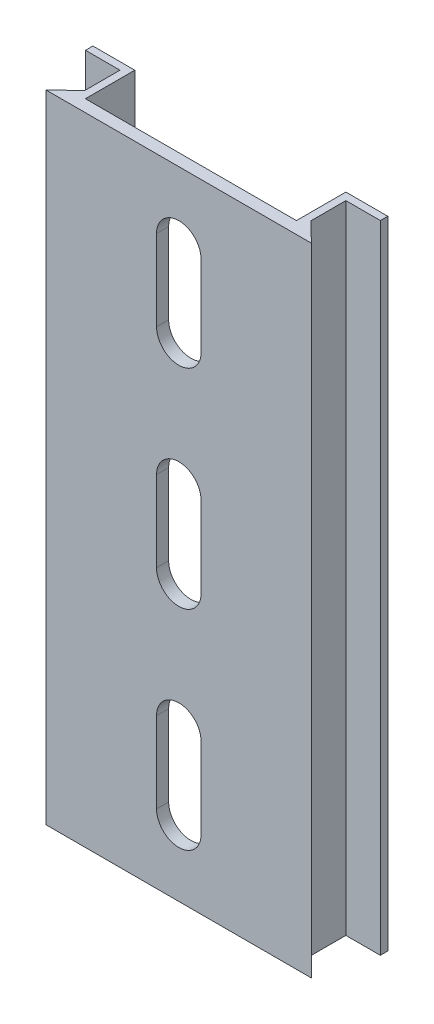
ISO-10303-21;
HEADER;
FILE_DESCRIPTION(('STEP AP214'),'2;1');
FILE_NAME('part.step','',(''),(''),'','','');
FILE_SCHEMA(('AUTOMOTIVE_DESIGN { 1 0 10303 214 1 1 1 1 }'));
ENDSEC;
DATA;
#1=APPLICATION_CONTEXT('core data for automotive mechanical design processes');
#2=APPLICATION_PROTOCOL_DEFINITION('international standard','automotive_design',2000,#1);
#3=PRODUCT_CONTEXT('',#1,'mechanical');
#4=PRODUCT('Part','Part','',(#3));
#5=PRODUCT_RELATED_PRODUCT_CATEGORY('part','',(#4));
#6=PRODUCT_DEFINITION_FORMATION('','',#4);
#7=PRODUCT_DEFINITION_CONTEXT('part definition',#1,'design');
#8=PRODUCT_DEFINITION('design','',#6,#7);
#9=PRODUCT_DEFINITION_SHAPE('','',#8);
#10=(LENGTH_UNIT() NAMED_UNIT(*) SI_UNIT(.MILLI.,.METRE.));
#11=(NAMED_UNIT(*) PLANE_ANGLE_UNIT() SI_UNIT($,.RADIAN.));
#12=(NAMED_UNIT(*) SI_UNIT($,.STERADIAN.) SOLID_ANGLE_UNIT());
#13=UNCERTAINTY_MEASURE_WITH_UNIT(LENGTH_MEASURE(1.E-05),#10,'distance_accuracy_value','');
#14=(GEOMETRIC_REPRESENTATION_CONTEXT(3) GLOBAL_UNCERTAINTY_ASSIGNED_CONTEXT((#13)) GLOBAL_UNIT_ASSIGNED_CONTEXT((#10,
#11,#12)) REPRESENTATION_CONTEXT('',''));
#15=CARTESIAN_POINT('',(0.,0.,0.));
#16=DIRECTION('',(0.,0.,1.));
#17=DIRECTION('',(1.,0.,0.));
#18=AXIS2_PLACEMENT_3D('',#15,#16,#17);
#19=CARTESIAN_POINT('',(0.,38.1,-1.4478));
#20=DIRECTION('',(0.,0.,-1.));
#21=DIRECTION('',(-1.,0.,0.));
#22=AXIS2_PLACEMENT_3D('',#19,#20,#21);
#23=PLANE('',#22);
#24=CARTESIAN_POINT('',(0.,20.167,-1.4478));
#25=DIRECTION('',(0.,0.,-1.));
#26=DIRECTION('',(-1.,0.,0.));
#27=AXIS2_PLACEMENT_3D('',#24,#25,#26);
#28=CIRCLE('',#27,2.667);
#29=CARTESIAN_POINT('',(2.667,20.167,-1.4478));
#30=VERTEX_POINT('',#29);
#31=CARTESIAN_POINT('',(-2.667,20.167,-1.4478));
#32=VERTEX_POINT('',#31);
#33=EDGE_CURVE('E219',#30,#32,#28,.T.);
#34=ORIENTED_EDGE('',*,*,#33,.F.);
#35=DIRECTION('',(0.,-1.,0.));
#36=VECTOR('',#35,1.);
#37=CARTESIAN_POINT('',(2.667,63.1,-1.4478));
#38=LINE('',#37,#36);
#39=CARTESIAN_POINT('',(2.667,29.833,-1.4478));
#40=VERTEX_POINT('',#39);
#41=EDGE_CURVE('E208',#40,#30,#38,.T.);
#42=ORIENTED_EDGE('',*,*,#41,.F.);
#43=CARTESIAN_POINT('',(0.,29.833,-1.4478));
#44=DIRECTION('',(0.,0.,-1.));
#45=DIRECTION('',(-1.,0.,0.));
#46=AXIS2_PLACEMENT_3D('',#43,#44,#45);
#47=CIRCLE('',#46,2.667);
#48=CARTESIAN_POINT('',(-2.667,29.833,-1.4478));
#49=VERTEX_POINT('',#48);
#50=EDGE_CURVE('E49',#49,#40,#47,.T.);
#51=ORIENTED_EDGE('',*,*,#50,.F.);
#52=DIRECTION('',(0.,1.,0.));
#53=VECTOR('',#52,1.);
#54=CARTESIAN_POINT('',(-2.667,63.1,-1.4478));
#55=LINE('',#54,#53);
#56=EDGE_CURVE('E224',#32,#49,#55,.T.);
#57=ORIENTED_EDGE('',*,*,#56,.F.);
#58=EDGE_LOOP('',(#34,#42,#51,#57));
#59=FACE_BOUND('',#58,.T.);
#60=CARTESIAN_POINT('',(0.,-29.833,-1.4478));
#61=DIRECTION('',(0.,0.,-1.));
#62=DIRECTION('',(-1.,0.,0.));
#63=AXIS2_PLACEMENT_3D('',#60,#61,#62);
#64=CIRCLE('',#63,2.667);
#65=CARTESIAN_POINT('',(2.667,-29.833,-1.4478));
#66=VERTEX_POINT('',#65);
#67=CARTESIAN_POINT('',(-2.667,-29.833,-1.4478));
#68=VERTEX_POINT('',#67);
#69=EDGE_CURVE('E257',#66,#68,#64,.T.);
#70=ORIENTED_EDGE('',*,*,#69,.F.);
#71=DIRECTION('',(0.,-1.,0.));
#72=VECTOR('',#71,1.);
#73=CARTESIAN_POINT('',(2.667,13.1,-1.4478));
#74=LINE('',#73,#72);
#75=CARTESIAN_POINT('',(2.667,-20.167,-1.4478));
#76=VERTEX_POINT('',#75);
#77=EDGE_CURVE('E227',#76,#66,#74,.T.);
#78=ORIENTED_EDGE('',*,*,#77,.F.);
#79=CARTESIAN_POINT('',(0.,-20.167,-1.4478));
#80=DIRECTION('',(0.,0.,-1.));
#81=DIRECTION('',(-1.,0.,0.));
#82=AXIS2_PLACEMENT_3D('',#79,#80,#81);
#83=CIRCLE('',#82,2.667);
#84=CARTESIAN_POINT('',(-2.667,-20.167,-1.4478));
#85=VERTEX_POINT('',#84);
#86=EDGE_CURVE('E242',#85,#76,#83,.T.);
#87=ORIENTED_EDGE('',*,*,#86,.F.);
#88=DIRECTION('',(0.,1.,0.));
#89=VECTOR('',#88,1.);
#90=CARTESIAN_POINT('',(-2.667,13.1,-1.4478));
#91=LINE('',#90,#89);
#92=EDGE_CURVE('E249',#68,#85,#91,.T.);
#93=ORIENTED_EDGE('',*,*,#92,.F.);
#94=EDGE_LOOP('',(#70,#78,#87,#93));
#95=FACE_BOUND('',#94,.T.);
#96=CARTESIAN_POINT('',(0.,-4.833,-1.4478));
#97=DIRECTION('',(0.,0.,-1.));
#98=DIRECTION('',(-1.,0.,0.));
#99=AXIS2_PLACEMENT_3D('',#96,#97,#98);
#100=CIRCLE('',#99,2.667);
#101=CARTESIAN_POINT('',(2.667,-4.833,-1.4478));
#102=VERTEX_POINT('',#101);
#103=CARTESIAN_POINT('',(-2.667,-4.833,-1.4478));
#104=VERTEX_POINT('',#103);
#105=EDGE_CURVE('E289',#102,#104,#100,.T.);
#106=ORIENTED_EDGE('',*,*,#105,.F.);
#107=DIRECTION('',(0.,-1.,0.));
#108=VECTOR('',#107,1.);
#109=CARTESIAN_POINT('',(2.667,38.1,-1.4478));
#110=LINE('',#109,#108);
#111=CARTESIAN_POINT('',(2.667,4.833,-1.4478));
#112=VERTEX_POINT('',#111);
#113=EDGE_CURVE('E276',#112,#102,#110,.T.);
#114=ORIENTED_EDGE('',*,*,#113,.F.);
#115=CARTESIAN_POINT('',(0.,4.833,-1.4478));
#116=DIRECTION('',(0.,0.,-1.));
#117=DIRECTION('',(-1.,0.,0.));
#118=AXIS2_PLACEMENT_3D('',#115,#116,#117);
#119=CIRCLE('',#118,2.667);
#120=CARTESIAN_POINT('',(-2.667,4.833,-1.4478));
#121=VERTEX_POINT('',#120);
#122=EDGE_CURVE('E284',#121,#112,#119,.T.);
#123=ORIENTED_EDGE('',*,*,#122,.F.);
#124=DIRECTION('',(0.,1.,0.));
#125=VECTOR('',#124,1.);
#126=CARTESIAN_POINT('',(-2.667,38.1,-1.4478));
#127=LINE('',#126,#125);
#128=EDGE_CURVE('E287',#104,#121,#127,.T.);
#129=ORIENTED_EDGE('',*,*,#128,.F.);
#130=EDGE_LOOP('',(#106,#114,#123,#129));
#131=FACE_BOUND('',#130,.T.);
#132=DIRECTION('',(1.,0.,0.));
#133=VECTOR('',#132,1.);
#134=CARTESIAN_POINT('',(0.,-38.1,-1.4478));
#135=LINE('',#134,#133);
#136=CARTESIAN_POINT('',(-12.6365,-38.1,-1.4478));
#137=VERTEX_POINT('',#136);
#138=CARTESIAN_POINT('',(12.6365,-38.1,-1.4478));
#139=VERTEX_POINT('',#138);
#140=EDGE_CURVE('E291',#137,#139,#135,.T.);
#141=ORIENTED_EDGE('',*,*,#140,.F.);
#142=DIRECTION('',(0.,-1.,0.));
#143=VECTOR('',#142,1.);
#144=CARTESIAN_POINT('',(-12.6365,38.1,-1.4478));
#145=LINE('',#144,#143);
#146=CARTESIAN_POINT('',(-12.6365,38.1,-1.4478));
#147=VERTEX_POINT('',#146);
#148=EDGE_CURVE('E11',#147,#137,#145,.T.);
#149=ORIENTED_EDGE('',*,*,#148,.F.);
#150=DIRECTION('',(1.,0.,0.));
#151=VECTOR('',#150,1.);
#152=CARTESIAN_POINT('',(0.,38.1,-1.4478));
#153=LINE('',#152,#151);
#154=CARTESIAN_POINT('',(12.6365,38.1,-1.4478));
#155=VERTEX_POINT('',#154);
#156=EDGE_CURVE('E292',#147,#155,#153,.T.);
#157=ORIENTED_EDGE('',*,*,#156,.T.);
#158=DIRECTION('',(0.,-1.,0.));
#159=VECTOR('',#158,1.);
#160=CARTESIAN_POINT('',(12.6365,38.1,-1.4478));
#161=LINE('',#160,#159);
#162=EDGE_CURVE('E329',#155,#139,#161,.T.);
#163=ORIENTED_EDGE('',*,*,#162,.T.);
#164=EDGE_LOOP('',(#141,#149,#157,#163));
#165=FACE_BOUND('',#164,.T.);
#166=ADVANCED_FACE('F35',(#59,#95,#131,#165),#23,.T.);
#167=CARTESIAN_POINT('',(-12.6365,38.1,0.));
#168=DIRECTION('',(-1.,0.,0.));
#169=DIRECTION('',(0.,0.,1.));
#170=AXIS2_PLACEMENT_3D('',#167,#168,#169);
#171=PLANE('',#170);
#172=DIRECTION('',(0.,0.,-1.));
#173=VECTOR('',#172,1.);
#174=CARTESIAN_POINT('',(-12.6365,-38.1,0.));
#175=LINE('',#174,#173);
#176=CARTESIAN_POINT('',(-12.6365,-38.1,-7.366));
#177=VERTEX_POINT('',#176);
#178=EDGE_CURVE('E332',#137,#177,#175,.T.);
#179=ORIENTED_EDGE('',*,*,#178,.T.);
#180=DIRECTION('',(0.,-1.,0.));
#181=VECTOR('',#180,1.);
#182=CARTESIAN_POINT('',(-12.6365,38.1,-7.366));
#183=LINE('',#182,#181);
#184=CARTESIAN_POINT('',(-12.6365,38.1,-7.366));
#185=VERTEX_POINT('',#184);
#186=EDGE_CURVE('E42',#185,#177,#183,.T.);
#187=ORIENTED_EDGE('',*,*,#186,.F.);
#188=DIRECTION('',(0.,0.,-1.));
#189=VECTOR('',#188,1.);
#190=CARTESIAN_POINT('',(-12.6365,38.1,0.));
#191=LINE('',#190,#189);
#192=EDGE_CURVE('E295',#147,#185,#191,.T.);
#193=ORIENTED_EDGE('',*,*,#192,.F.);
#194=ORIENTED_EDGE('',*,*,#148,.T.);
#195=EDGE_LOOP('',(#179,#187,#193,#194));
#196=FACE_BOUND('',#195,.T.);
#197=ADVANCED_FACE('F421',(#196),#171,.F.);
#198=CARTESIAN_POINT('',(0.,38.1,-7.366));
#199=DIRECTION('',(0.,0.,1.));
#200=DIRECTION('',(1.,0.,0.));
#201=AXIS2_PLACEMENT_3D('',#198,#199,#200);
#202=PLANE('',#201);
#203=DIRECTION('',(-1.,0.,0.));
#204=VECTOR('',#203,1.);
#205=CARTESIAN_POINT('',(0.,-38.1,-7.366));
#206=LINE('',#205,#204);
#207=CARTESIAN_POINT('',(-17.653,-38.1,-7.366));
#208=VERTEX_POINT('',#207);
#209=EDGE_CURVE('E334',#177,#208,#206,.T.);
#210=ORIENTED_EDGE('',*,*,#209,.T.);
#211=DIRECTION('',(0.,-1.,0.));
#212=VECTOR('',#211,1.);
#213=CARTESIAN_POINT('',(-17.653,38.1,-7.366));
#214=LINE('',#213,#212);
#215=CARTESIAN_POINT('',(-17.653,38.1,-7.366));
#216=VERTEX_POINT('',#215);
#217=EDGE_CURVE('E389',#216,#208,#214,.T.);
#218=ORIENTED_EDGE('',*,*,#217,.F.);
#219=DIRECTION('',(-1.,0.,0.));
#220=VECTOR('',#219,1.);
#221=CARTESIAN_POINT('',(0.,38.1,-7.366));
#222=LINE('',#221,#220);
#223=EDGE_CURVE('E298',#185,#216,#222,.T.);
#224=ORIENTED_EDGE('',*,*,#223,.F.);
#225=ORIENTED_EDGE('',*,*,#186,.T.);
#226=EDGE_LOOP('',(#210,#218,#224,#225));
#227=FACE_BOUND('',#226,.T.);
#228=ADVANCED_FACE('F396',(#227),#202,.F.);
#229=CARTESIAN_POINT('',(-17.653,38.1,0.));
#230=DIRECTION('',(1.,0.,0.));
#231=DIRECTION('',(0.,0.,-1.));
#232=AXIS2_PLACEMENT_3D('',#229,#230,#231);
#233=PLANE('',#232);
#234=DIRECTION('',(0.,0.,1.));
#235=VECTOR('',#234,1.);
#236=CARTESIAN_POINT('',(-17.653,-38.1,0.));
#237=LINE('',#236,#235);
#238=CARTESIAN_POINT('',(-17.653,-38.1,-6.477));
#239=VERTEX_POINT('',#238);
#240=EDGE_CURVE('E336',#208,#239,#237,.T.);
#241=ORIENTED_EDGE('',*,*,#240,.T.);
#242=DIRECTION('',(0.,-1.,0.));
#243=VECTOR('',#242,1.);
#244=CARTESIAN_POINT('',(-17.653,38.1,-6.477));
#245=LINE('',#244,#243);
#246=CARTESIAN_POINT('',(-17.653,38.1,-6.477));
#247=VERTEX_POINT('',#246);
#248=EDGE_CURVE('E386',#247,#239,#245,.T.);
#249=ORIENTED_EDGE('',*,*,#248,.F.);
#250=DIRECTION('',(0.,0.,1.));
#251=VECTOR('',#250,1.);
#252=CARTESIAN_POINT('',(-17.653,38.1,0.));
#253=LINE('',#252,#251);
#254=EDGE_CURVE('E300',#216,#247,#253,.T.);
#255=ORIENTED_EDGE('',*,*,#254,.F.);
#256=ORIENTED_EDGE('',*,*,#217,.T.);
#257=EDGE_LOOP('',(#241,#249,#255,#256));
#258=FACE_BOUND('',#257,.T.);
#259=ADVANCED_FACE('F409',(#258),#233,.F.);
#260=CARTESIAN_POINT('',(0.,38.1,-6.477));
#261=DIRECTION('',(0.,0.,-1.));
#262=DIRECTION('',(-1.,0.,0.));
#263=AXIS2_PLACEMENT_3D('',#260,#261,#262);
#264=PLANE('',#263);
#265=DIRECTION('',(1.,0.,0.));
#266=VECTOR('',#265,1.);
#267=CARTESIAN_POINT('',(0.,-38.1,-6.477));
#268=LINE('',#267,#266);
#269=CARTESIAN_POINT('',(-13.5255,-38.1,-6.477));
#270=VERTEX_POINT('',#269);
#271=EDGE_CURVE('E338',#239,#270,#268,.T.);
#272=ORIENTED_EDGE('',*,*,#271,.T.);
#273=DIRECTION('',(0.,-1.,0.));
#274=VECTOR('',#273,1.);
#275=CARTESIAN_POINT('',(-13.5255,38.1,-6.477));
#276=LINE('',#275,#274);
#277=CARTESIAN_POINT('',(-13.5255,38.1,-6.477));
#278=VERTEX_POINT('',#277);
#279=EDGE_CURVE('E383',#278,#270,#276,.T.);
#280=ORIENTED_EDGE('',*,*,#279,.F.);
#281=DIRECTION('',(1.,0.,0.));
#282=VECTOR('',#281,1.);
#283=CARTESIAN_POINT('',(0.,38.1,-6.477));
#284=LINE('',#283,#282);
#285=EDGE_CURVE('E302',#247,#278,#284,.T.);
#286=ORIENTED_EDGE('',*,*,#285,.F.);
#287=ORIENTED_EDGE('',*,*,#248,.T.);
#288=EDGE_LOOP('',(#272,#280,#286,#287));
#289=FACE_BOUND('',#288,.T.);
#290=ADVANCED_FACE('F413',(#289),#264,.F.);
#291=CARTESIAN_POINT('',(-13.5255,38.1,0.));
#292=DIRECTION('',(1.,0.,0.));
#293=DIRECTION('',(0.,0.,-1.));
#294=AXIS2_PLACEMENT_3D('',#291,#292,#293);
#295=PLANE('',#294);
#296=DIRECTION('',(0.,0.,1.));
#297=VECTOR('',#296,1.);
#298=CARTESIAN_POINT('',(-13.5255,-38.1,0.));
#299=LINE('',#298,#297);
#300=CARTESIAN_POINT('',(-13.5255,-38.1,-2.286));
#301=VERTEX_POINT('',#300);
#302=EDGE_CURVE('E340',#270,#301,#299,.T.);
#303=ORIENTED_EDGE('',*,*,#302,.T.);
#304=DIRECTION('',(0.,-1.,0.));
#305=VECTOR('',#304,1.);
#306=CARTESIAN_POINT('',(-13.5255,38.1,-2.286));
#307=LINE('',#306,#305);
#308=CARTESIAN_POINT('',(-13.5255,38.1,-2.286));
#309=VERTEX_POINT('',#308);
#310=EDGE_CURVE('E380',#309,#301,#307,.T.);
#311=ORIENTED_EDGE('',*,*,#310,.F.);
#312=DIRECTION('',(0.,0.,1.));
#313=VECTOR('',#312,1.);
#314=CARTESIAN_POINT('',(-13.5255,38.1,0.));
#315=LINE('',#314,#313);
#316=EDGE_CURVE('E304',#278,#309,#315,.T.);
#317=ORIENTED_EDGE('',*,*,#316,.F.);
#318=ORIENTED_EDGE('',*,*,#279,.T.);
#319=EDGE_LOOP('',(#303,#311,#317,#318));
#320=FACE_BOUND('',#319,.T.);
#321=ADVANCED_FACE('F456',(#320),#295,.F.);
#322=CARTESIAN_POINT('',(-7.72007504690431,38.1,-7.93452157598499));
#323=DIRECTION('',(0.697354959803453,0.,0.716725930909106));
#324=DIRECTION('',(0.716725930909106,0.,-0.697354959803453));
#325=AXIS2_PLACEMENT_3D('',#322,#323,#324);
#326=PLANE('',#325);
#327=DIRECTION('',(-0.716725930909106,0.,0.697354959803454));
#328=VECTOR('',#327,1.);
#329=CARTESIAN_POINT('',(-7.72007504690431,-38.1,-7.93452157598499));
#330=LINE('',#329,#328);
#331=CARTESIAN_POINT('',(-15.875,-38.1,0.));
#332=VERTEX_POINT('',#331);
#333=EDGE_CURVE('E342',#301,#332,#330,.T.);
#334=ORIENTED_EDGE('',*,*,#333,.T.);
#335=DIRECTION('',(0.,-1.,0.));
#336=VECTOR('',#335,1.);
#337=CARTESIAN_POINT('',(-15.875,38.1,0.));
#338=LINE('',#337,#336);
#339=CARTESIAN_POINT('',(-15.875,38.1,0.));
#340=VERTEX_POINT('',#339);
#341=EDGE_CURVE('E378',#340,#332,#338,.T.);
#342=ORIENTED_EDGE('',*,*,#341,.F.);
#343=DIRECTION('',(-0.716725930909106,0.,0.697354959803454));
#344=VECTOR('',#343,1.);
#345=CARTESIAN_POINT('',(-7.72007504690431,38.1,-7.93452157598499));
#346=LINE('',#345,#344);
#347=EDGE_CURVE('E306',#309,#340,#346,.T.);
#348=ORIENTED_EDGE('',*,*,#347,.F.);
#349=ORIENTED_EDGE('',*,*,#310,.T.);
#350=EDGE_LOOP('',(#334,#342,#348,#349));
#351=FACE_BOUND('',#350,.T.);
#352=ADVANCED_FACE('F454',(#351),#326,.F.);
#353=CARTESIAN_POINT('',(0.,38.1,0.));
#354=DIRECTION('',(0.,0.,1.));
#355=DIRECTION('',(1.,0.,0.));
#356=AXIS2_PLACEMENT_3D('',#353,#354,#355);
#357=PLANE('',#356);
#358=CARTESIAN_POINT('',(0.,20.167,0.));
#359=DIRECTION('',(0.,0.,1.));
#360=DIRECTION('',(1.,0.,0.));
#361=AXIS2_PLACEMENT_3D('',#358,#359,#360);
#362=CIRCLE('',#361,2.667);
#363=CARTESIAN_POINT('',(-2.667,20.167,0.));
#364=VERTEX_POINT('',#363);
#365=CARTESIAN_POINT('',(2.667,20.167,0.));
#366=VERTEX_POINT('',#365);
#367=EDGE_CURVE('E57',#364,#366,#362,.T.);
#368=ORIENTED_EDGE('',*,*,#367,.F.);
#369=DIRECTION('',(0.,-1.,0.));
#370=VECTOR('',#369,1.);
#371=CARTESIAN_POINT('',(-2.667,20.167,0.));
#372=LINE('',#371,#370);
#373=CARTESIAN_POINT('',(-2.667,29.833,0.));
#374=VERTEX_POINT('',#373);
#375=EDGE_CURVE('E229',#374,#364,#372,.T.);
#376=ORIENTED_EDGE('',*,*,#375,.F.);
#377=CARTESIAN_POINT('',(0.,29.833,0.));
#378=DIRECTION('',(0.,0.,1.));
#379=DIRECTION('',(1.,0.,0.));
#380=AXIS2_PLACEMENT_3D('',#377,#378,#379);
#381=CIRCLE('',#380,2.667);
#382=CARTESIAN_POINT('',(2.667,29.833,0.));
#383=VERTEX_POINT('',#382);
#384=EDGE_CURVE('E696',#383,#374,#381,.T.);
#385=ORIENTED_EDGE('',*,*,#384,.F.);
#386=DIRECTION('',(0.,1.,0.));
#387=VECTOR('',#386,1.);
#388=CARTESIAN_POINT('',(2.667,20.167,0.));
#389=LINE('',#388,#387);
#390=EDGE_CURVE('E215',#366,#383,#389,.T.);
#391=ORIENTED_EDGE('',*,*,#390,.F.);
#392=EDGE_LOOP('',(#368,#376,#385,#391));
#393=FACE_BOUND('',#392,.T.);
#394=CARTESIAN_POINT('',(0.,-29.833,0.));
#395=DIRECTION('',(0.,0.,1.));
#396=DIRECTION('',(1.,0.,0.));
#397=AXIS2_PLACEMENT_3D('',#394,#395,#396);
#398=CIRCLE('',#397,2.667);
#399=CARTESIAN_POINT('',(-2.667,-29.833,0.));
#400=VERTEX_POINT('',#399);
#401=CARTESIAN_POINT('',(2.667,-29.833,0.));
#402=VERTEX_POINT('',#401);
#403=EDGE_CURVE('E260',#400,#402,#398,.T.);
#404=ORIENTED_EDGE('',*,*,#403,.F.);
#405=DIRECTION('',(0.,-1.,0.));
#406=VECTOR('',#405,1.);
#407=CARTESIAN_POINT('',(-2.667,-29.833,0.));
#408=LINE('',#407,#406);
#409=CARTESIAN_POINT('',(-2.667,-20.167,0.));
#410=VERTEX_POINT('',#409);
#411=EDGE_CURVE('E252',#410,#400,#408,.T.);
#412=ORIENTED_EDGE('',*,*,#411,.F.);
#413=CARTESIAN_POINT('',(0.,-20.167,0.));
#414=DIRECTION('',(0.,0.,1.));
#415=DIRECTION('',(1.,0.,0.));
#416=AXIS2_PLACEMENT_3D('',#413,#414,#415);
#417=CIRCLE('',#416,2.667);
#418=CARTESIAN_POINT('',(2.667,-20.167,0.));
#419=VERTEX_POINT('',#418);
#420=EDGE_CURVE('E244',#419,#410,#417,.T.);
#421=ORIENTED_EDGE('',*,*,#420,.F.);
#422=DIRECTION('',(0.,1.,0.));
#423=VECTOR('',#422,1.);
#424=CARTESIAN_POINT('',(2.667,-29.833,0.));
#425=LINE('',#424,#423);
#426=EDGE_CURVE('E234',#402,#419,#425,.T.);
#427=ORIENTED_EDGE('',*,*,#426,.F.);
#428=EDGE_LOOP('',(#404,#412,#421,#427));
#429=FACE_BOUND('',#428,.T.);
#430=CARTESIAN_POINT('',(0.,-4.833,0.));
#431=DIRECTION('',(0.,0.,1.));
#432=DIRECTION('',(1.,0.,0.));
#433=AXIS2_PLACEMENT_3D('',#430,#431,#432);
#434=CIRCLE('',#433,2.667);
#435=CARTESIAN_POINT('',(-2.667,-4.833,0.));
#436=VERTEX_POINT('',#435);
#437=CARTESIAN_POINT('',(2.667,-4.833,0.));
#438=VERTEX_POINT('',#437);
#439=EDGE_CURVE('E262',#436,#438,#434,.T.);
#440=ORIENTED_EDGE('',*,*,#439,.F.);
#441=DIRECTION('',(0.,-1.,0.));
#442=VECTOR('',#441,1.);
#443=CARTESIAN_POINT('',(-2.667,-4.833,0.));
#444=LINE('',#443,#442);
#445=CARTESIAN_POINT('',(-2.667,4.833,0.));
#446=VERTEX_POINT('',#445);
#447=EDGE_CURVE('E270',#446,#436,#444,.T.);
#448=ORIENTED_EDGE('',*,*,#447,.F.);
#449=CARTESIAN_POINT('',(0.,4.833,0.));
#450=DIRECTION('',(0.,0.,1.));
#451=DIRECTION('',(1.,0.,0.));
#452=AXIS2_PLACEMENT_3D('',#449,#450,#451);
#453=CIRCLE('',#452,2.667);
#454=CARTESIAN_POINT('',(2.667,4.833,0.));
#455=VERTEX_POINT('',#454);
#456=EDGE_CURVE('E267',#455,#446,#453,.T.);
#457=ORIENTED_EDGE('',*,*,#456,.F.);
#458=DIRECTION('',(0.,1.,0.));
#459=VECTOR('',#458,1.);
#460=CARTESIAN_POINT('',(2.667,-4.833,0.));
#461=LINE('',#460,#459);
#462=EDGE_CURVE('E264',#438,#455,#461,.T.);
#463=ORIENTED_EDGE('',*,*,#462,.F.);
#464=EDGE_LOOP('',(#440,#448,#457,#463));
#465=FACE_BOUND('',#464,.T.);
#466=DIRECTION('',(-1.,0.,0.));
#467=VECTOR('',#466,1.);
#468=CARTESIAN_POINT('',(0.,-38.1,0.));
#469=LINE('',#468,#467);
#470=CARTESIAN_POINT('',(15.875,-38.1,0.));
#471=VERTEX_POINT('',#470);
#472=EDGE_CURVE('E345',#471,#332,#469,.T.);
#473=ORIENTED_EDGE('',*,*,#472,.F.);
#474=DIRECTION('',(0.,-1.,0.));
#475=VECTOR('',#474,1.);
#476=CARTESIAN_POINT('',(15.875,38.1,0.));
#477=LINE('',#476,#475);
#478=CARTESIAN_POINT('',(15.875,38.1,0.));
#479=VERTEX_POINT('',#478);
#480=EDGE_CURVE('E376',#479,#471,#477,.T.);
#481=ORIENTED_EDGE('',*,*,#480,.F.);
#482=DIRECTION('',(-1.,0.,0.));
#483=VECTOR('',#482,1.);
#484=CARTESIAN_POINT('',(0.,38.1,0.));
#485=LINE('',#484,#483);
#486=EDGE_CURVE('E308',#479,#340,#485,.T.);
#487=ORIENTED_EDGE('',*,*,#486,.T.);
#488=ORIENTED_EDGE('',*,*,#341,.T.);
#489=EDGE_LOOP('',(#473,#481,#487,#488));
#490=FACE_BOUND('',#489,.T.);
#491=ADVANCED_FACE('F450',(#393,#429,#465,#490),#357,.T.);
#492=CARTESIAN_POINT('',(7.72007504690431,38.1,-7.93452157598499));
#493=DIRECTION('',(0.697354959803453,0.,-0.716725930909106));
#494=DIRECTION('',(-0.716725930909106,0.,-0.697354959803453));
#495=AXIS2_PLACEMENT_3D('',#492,#493,#494);
#496=PLANE('',#495);
#497=DIRECTION('',(0.716725930909106,0.,0.697354959803454));
#498=VECTOR('',#497,1.);
#499=CARTESIAN_POINT('',(7.72007504690431,-38.1,-7.93452157598499));
#500=LINE('',#499,#498);
#501=CARTESIAN_POINT('',(13.5255,-38.1,-2.286));
#502=VERTEX_POINT('',#501);
#503=EDGE_CURVE('E348',#502,#471,#500,.T.);
#504=ORIENTED_EDGE('',*,*,#503,.F.);
#505=DIRECTION('',(0.,-1.,0.));
#506=VECTOR('',#505,1.);
#507=CARTESIAN_POINT('',(13.5255,38.1,-2.286));
#508=LINE('',#507,#506);
#509=CARTESIAN_POINT('',(13.5255,38.1,-2.286));
#510=VERTEX_POINT('',#509);
#511=EDGE_CURVE('E374',#510,#502,#508,.T.);
#512=ORIENTED_EDGE('',*,*,#511,.F.);
#513=DIRECTION('',(0.716725930909106,0.,0.697354959803454));
#514=VECTOR('',#513,1.);
#515=CARTESIAN_POINT('',(7.72007504690431,38.1,-7.93452157598499));
#516=LINE('',#515,#514);
#517=EDGE_CURVE('E311',#510,#479,#516,.T.);
#518=ORIENTED_EDGE('',*,*,#517,.T.);
#519=ORIENTED_EDGE('',*,*,#480,.T.);
#520=EDGE_LOOP('',(#504,#512,#518,#519));
#521=FACE_BOUND('',#520,.T.);
#522=ADVANCED_FACE('F446',(#521),#496,.T.);
#523=CARTESIAN_POINT('',(13.5255,38.1,0.));
#524=DIRECTION('',(1.,0.,0.));
#525=DIRECTION('',(0.,0.,-1.));
#526=AXIS2_PLACEMENT_3D('',#523,#524,#525);
#527=PLANE('',#526);
#528=DIRECTION('',(0.,0.,1.));
#529=VECTOR('',#528,1.);
#530=CARTESIAN_POINT('',(13.5255,-38.1,0.));
#531=LINE('',#530,#529);
#532=CARTESIAN_POINT('',(13.5255,-38.1,-6.477));
#533=VERTEX_POINT('',#532);
#534=EDGE_CURVE('E351',#533,#502,#531,.T.);
#535=ORIENTED_EDGE('',*,*,#534,.F.);
#536=DIRECTION('',(0.,-1.,0.));
#537=VECTOR('',#536,1.);
#538=CARTESIAN_POINT('',(13.5255,38.1,-6.477));
#539=LINE('',#538,#537);
#540=CARTESIAN_POINT('',(13.5255,38.1,-6.477));
#541=VERTEX_POINT('',#540);
#542=EDGE_CURVE('E372',#541,#533,#539,.T.);
#543=ORIENTED_EDGE('',*,*,#542,.F.);
#544=DIRECTION('',(0.,0.,1.));
#545=VECTOR('',#544,1.);
#546=CARTESIAN_POINT('',(13.5255,38.1,0.));
#547=LINE('',#546,#545);
#548=EDGE_CURVE('E314',#541,#510,#547,.T.);
#549=ORIENTED_EDGE('',*,*,#548,.T.);
#550=ORIENTED_EDGE('',*,*,#511,.T.);
#551=EDGE_LOOP('',(#535,#543,#549,#550));
#552=FACE_BOUND('',#551,.T.);
#553=ADVANCED_FACE('F441',(#552),#527,.T.);
#554=CARTESIAN_POINT('',(0.,38.1,-6.477));
#555=DIRECTION('',(0.,0.,1.));
#556=DIRECTION('',(1.,0.,0.));
#557=AXIS2_PLACEMENT_3D('',#554,#555,#556);
#558=PLANE('',#557);
#559=DIRECTION('',(-1.,0.,0.));
#560=VECTOR('',#559,1.);
#561=CARTESIAN_POINT('',(0.,-38.1,-6.477));
#562=LINE('',#561,#560);
#563=CARTESIAN_POINT('',(17.653,-38.1,-6.477));
#564=VERTEX_POINT('',#563);
#565=EDGE_CURVE('E354',#564,#533,#562,.T.);
#566=ORIENTED_EDGE('',*,*,#565,.F.);
#567=DIRECTION('',(0.,-1.,0.));
#568=VECTOR('',#567,1.);
#569=CARTESIAN_POINT('',(17.653,38.1,-6.477));
#570=LINE('',#569,#568);
#571=CARTESIAN_POINT('',(17.653,38.1,-6.477));
#572=VERTEX_POINT('',#571);
#573=EDGE_CURVE('E370',#572,#564,#570,.T.);
#574=ORIENTED_EDGE('',*,*,#573,.F.);
#575=DIRECTION('',(-1.,0.,0.));
#576=VECTOR('',#575,1.);
#577=CARTESIAN_POINT('',(0.,38.1,-6.477));
#578=LINE('',#577,#576);
#579=EDGE_CURVE('E317',#572,#541,#578,.T.);
#580=ORIENTED_EDGE('',*,*,#579,.T.);
#581=ORIENTED_EDGE('',*,*,#542,.T.);
#582=EDGE_LOOP('',(#566,#574,#580,#581));
#583=FACE_BOUND('',#582,.T.);
#584=ADVANCED_FACE('F437',(#583),#558,.T.);
#585=CARTESIAN_POINT('',(17.653,38.1,0.));
#586=DIRECTION('',(1.,0.,0.));
#587=DIRECTION('',(0.,0.,-1.));
#588=AXIS2_PLACEMENT_3D('',#585,#586,#587);
#589=PLANE('',#588);
#590=DIRECTION('',(0.,0.,1.));
#591=VECTOR('',#590,1.);
#592=CARTESIAN_POINT('',(17.653,-38.1,0.));
#593=LINE('',#592,#591);
#594=CARTESIAN_POINT('',(17.653,-38.1,-7.366));
#595=VERTEX_POINT('',#594);
#596=EDGE_CURVE('E357',#595,#564,#593,.T.);
#597=ORIENTED_EDGE('',*,*,#596,.F.);
#598=DIRECTION('',(0.,-1.,0.));
#599=VECTOR('',#598,1.);
#600=CARTESIAN_POINT('',(17.653,38.1,-7.366));
#601=LINE('',#600,#599);
#602=CARTESIAN_POINT('',(17.653,38.1,-7.366));
#603=VERTEX_POINT('',#602);
#604=EDGE_CURVE('E368',#603,#595,#601,.T.);
#605=ORIENTED_EDGE('',*,*,#604,.F.);
#606=DIRECTION('',(0.,0.,1.));
#607=VECTOR('',#606,1.);
#608=CARTESIAN_POINT('',(17.653,38.1,0.));
#609=LINE('',#608,#607);
#610=EDGE_CURVE('E320',#603,#572,#609,.T.);
#611=ORIENTED_EDGE('',*,*,#610,.T.);
#612=ORIENTED_EDGE('',*,*,#573,.T.);
#613=EDGE_LOOP('',(#597,#605,#611,#612));
#614=FACE_BOUND('',#613,.T.);
#615=ADVANCED_FACE('F433',(#614),#589,.T.);
#616=CARTESIAN_POINT('',(0.,38.1,-7.366));
#617=DIRECTION('',(0.,0.,-1.));
#618=DIRECTION('',(-1.,0.,0.));
#619=AXIS2_PLACEMENT_3D('',#616,#617,#618);
#620=PLANE('',#619);
#621=DIRECTION('',(1.,0.,0.));
#622=VECTOR('',#621,1.);
#623=CARTESIAN_POINT('',(0.,-38.1,-7.366));
#624=LINE('',#623,#622);
#625=CARTESIAN_POINT('',(12.6365,-38.1,-7.366));
#626=VERTEX_POINT('',#625);
#627=EDGE_CURVE('E360',#626,#595,#624,.T.);
#628=ORIENTED_EDGE('',*,*,#627,.F.);
#629=DIRECTION('',(0.,-1.,0.));
#630=VECTOR('',#629,1.);
#631=CARTESIAN_POINT('',(12.6365,38.1,-7.366));
#632=LINE('',#631,#630);
#633=CARTESIAN_POINT('',(12.6365,38.1,-7.366));
#634=VERTEX_POINT('',#633);
#635=EDGE_CURVE('E366',#634,#626,#632,.T.);
#636=ORIENTED_EDGE('',*,*,#635,.F.);
#637=DIRECTION('',(1.,0.,0.));
#638=VECTOR('',#637,1.);
#639=CARTESIAN_POINT('',(0.,38.1,-7.366));
#640=LINE('',#639,#638);
#641=EDGE_CURVE('E323',#634,#603,#640,.T.);
#642=ORIENTED_EDGE('',*,*,#641,.T.);
#643=ORIENTED_EDGE('',*,*,#604,.T.);
#644=EDGE_LOOP('',(#628,#636,#642,#643));
#645=FACE_BOUND('',#644,.T.);
#646=ADVANCED_FACE('F429',(#645),#620,.T.);
#647=CARTESIAN_POINT('',(12.6365,38.1,0.));
#648=DIRECTION('',(-1.,0.,0.));
#649=DIRECTION('',(0.,0.,1.));
#650=AXIS2_PLACEMENT_3D('',#647,#648,#649);
#651=PLANE('',#650);
#652=DIRECTION('',(0.,0.,-1.));
#653=VECTOR('',#652,1.);
#654=CARTESIAN_POINT('',(12.6365,-38.1,0.));
#655=LINE('',#654,#653);
#656=EDGE_CURVE('E296',#139,#626,#655,.T.);
#657=ORIENTED_EDGE('',*,*,#656,.F.);
#658=ORIENTED_EDGE('',*,*,#162,.F.);
#659=DIRECTION('',(0.,0.,-1.));
#660=VECTOR('',#659,1.);
#661=CARTESIAN_POINT('',(12.6365,38.1,0.));
#662=LINE('',#661,#660);
#663=EDGE_CURVE('E326',#155,#634,#662,.T.);
#664=ORIENTED_EDGE('',*,*,#663,.T.);
#665=ORIENTED_EDGE('',*,*,#635,.T.);
#666=EDGE_LOOP('',(#657,#658,#664,#665));
#667=FACE_BOUND('',#666,.T.);
#668=ADVANCED_FACE('F425',(#667),#651,.T.);
#669=CARTESIAN_POINT('',(0.,38.1,0.));
#670=DIRECTION('',(0.,1.,0.));
#671=DIRECTION('',(0.,0.,1.));
#672=AXIS2_PLACEMENT_3D('',#669,#670,#671);
#673=PLANE('',#672);
#674=ORIENTED_EDGE('',*,*,#156,.F.);
#675=ORIENTED_EDGE('',*,*,#192,.T.);
#676=ORIENTED_EDGE('',*,*,#223,.T.);
#677=ORIENTED_EDGE('',*,*,#254,.T.);
#678=ORIENTED_EDGE('',*,*,#285,.T.);
#679=ORIENTED_EDGE('',*,*,#316,.T.);
#680=ORIENTED_EDGE('',*,*,#347,.T.);
#681=ORIENTED_EDGE('',*,*,#486,.F.);
#682=ORIENTED_EDGE('',*,*,#517,.F.);
#683=ORIENTED_EDGE('',*,*,#548,.F.);
#684=ORIENTED_EDGE('',*,*,#579,.F.);
#685=ORIENTED_EDGE('',*,*,#610,.F.);
#686=ORIENTED_EDGE('',*,*,#641,.F.);
#687=ORIENTED_EDGE('',*,*,#663,.F.);
#688=EDGE_LOOP('',(#674,#675,#676,#677,#678,#679,#680,#681,#682,#683,#684,#685,#686,#687));
#689=FACE_BOUND('',#688,.T.);
#690=ADVANCED_FACE('F418',(#689),#673,.T.);
#691=CARTESIAN_POINT('',(0.,-38.1,0.));
#692=DIRECTION('',(0.,1.,0.));
#693=DIRECTION('',(0.,0.,1.));
#694=AXIS2_PLACEMENT_3D('',#691,#692,#693);
#695=PLANE('',#694);
#696=ORIENTED_EDGE('',*,*,#140,.T.);
#697=ORIENTED_EDGE('',*,*,#656,.T.);
#698=ORIENTED_EDGE('',*,*,#627,.T.);
#699=ORIENTED_EDGE('',*,*,#596,.T.);
#700=ORIENTED_EDGE('',*,*,#565,.T.);
#701=ORIENTED_EDGE('',*,*,#534,.T.);
#702=ORIENTED_EDGE('',*,*,#503,.T.);
#703=ORIENTED_EDGE('',*,*,#472,.T.);
#704=ORIENTED_EDGE('',*,*,#333,.F.);
#705=ORIENTED_EDGE('',*,*,#302,.F.);
#706=ORIENTED_EDGE('',*,*,#271,.F.);
#707=ORIENTED_EDGE('',*,*,#240,.F.);
#708=ORIENTED_EDGE('',*,*,#209,.F.);
#709=ORIENTED_EDGE('',*,*,#178,.F.);
#710=EDGE_LOOP('',(#696,#697,#698,#699,#700,#701,#702,#703,#704,#705,#706,#707,#708,#709));
#711=FACE_BOUND('',#710,.T.);
#712=ADVANCED_FACE('F403',(#711),#695,.F.);
#713=CARTESIAN_POINT('',(0.,-4.833,-7.366));
#714=DIRECTION('',(0.,0.,1.));
#715=DIRECTION('',(1.,0.,0.));
#716=AXIS2_PLACEMENT_3D('',#713,#714,#715);
#717=CYLINDRICAL_SURFACE('',#716,2.667);
#718=ORIENTED_EDGE('',*,*,#105,.T.);
#719=DIRECTION('',(0.,0.,1.));
#720=VECTOR('',#719,1.);
#721=CARTESIAN_POINT('',(-2.667,-4.833,-7.366));
#722=LINE('',#721,#720);
#723=EDGE_CURVE('E274',#104,#436,#722,.T.);
#724=ORIENTED_EDGE('',*,*,#723,.T.);
#725=ORIENTED_EDGE('',*,*,#439,.T.);
#726=DIRECTION('',(0.,0.,1.));
#727=VECTOR('',#726,1.);
#728=CARTESIAN_POINT('',(2.667,-4.833,-7.366));
#729=LINE('',#728,#727);
#730=EDGE_CURVE('E273',#102,#438,#729,.T.);
#731=ORIENTED_EDGE('',*,*,#730,.F.);
#732=EDGE_LOOP('',(#718,#724,#725,#731));
#733=FACE_BOUND('',#732,.T.);
#734=ADVANCED_FACE('F562',(#733),#717,.F.);
#735=CARTESIAN_POINT('',(-2.667,-4.833,-7.366));
#736=DIRECTION('',(-1.,0.,0.));
#737=DIRECTION('',(0.,0.,1.));
#738=AXIS2_PLACEMENT_3D('',#735,#736,#737);
#739=PLANE('',#738);
#740=ORIENTED_EDGE('',*,*,#128,.T.);
#741=DIRECTION('',(0.,0.,1.));
#742=VECTOR('',#741,1.);
#743=CARTESIAN_POINT('',(-2.667,4.833,-7.366));
#744=LINE('',#743,#742);
#745=EDGE_CURVE('E277',#121,#446,#744,.T.);
#746=ORIENTED_EDGE('',*,*,#745,.T.);
#747=ORIENTED_EDGE('',*,*,#447,.T.);
#748=ORIENTED_EDGE('',*,*,#723,.F.);
#749=EDGE_LOOP('',(#740,#746,#747,#748));
#750=FACE_BOUND('',#749,.T.);
#751=ADVANCED_FACE('F571',(#750),#739,.F.);
#752=CARTESIAN_POINT('',(0.,4.833,-7.366));
#753=DIRECTION('',(0.,0.,1.));
#754=DIRECTION('',(1.,0.,0.));
#755=AXIS2_PLACEMENT_3D('',#752,#753,#754);
#756=CYLINDRICAL_SURFACE('',#755,2.667);
#757=ORIENTED_EDGE('',*,*,#122,.T.);
#758=DIRECTION('',(0.,0.,1.));
#759=VECTOR('',#758,1.);
#760=CARTESIAN_POINT('',(2.667,4.833,-7.366));
#761=LINE('',#760,#759);
#762=EDGE_CURVE('E279',#112,#455,#761,.T.);
#763=ORIENTED_EDGE('',*,*,#762,.T.);
#764=ORIENTED_EDGE('',*,*,#456,.T.);
#765=ORIENTED_EDGE('',*,*,#745,.F.);
#766=EDGE_LOOP('',(#757,#763,#764,#765));
#767=FACE_BOUND('',#766,.T.);
#768=ADVANCED_FACE('F581',(#767),#756,.F.);
#769=CARTESIAN_POINT('',(2.667,-4.833,-7.366));
#770=DIRECTION('',(1.,0.,0.));
#771=DIRECTION('',(0.,0.,-1.));
#772=AXIS2_PLACEMENT_3D('',#769,#770,#771);
#773=PLANE('',#772);
#774=ORIENTED_EDGE('',*,*,#113,.T.);
#775=ORIENTED_EDGE('',*,*,#730,.T.);
#776=ORIENTED_EDGE('',*,*,#462,.T.);
#777=ORIENTED_EDGE('',*,*,#762,.F.);
#778=EDGE_LOOP('',(#774,#775,#776,#777));
#779=FACE_BOUND('',#778,.T.);
#780=ADVANCED_FACE('F591',(#779),#773,.F.);
#781=CARTESIAN_POINT('',(0.,-29.833,-7.366));
#782=DIRECTION('',(0.,0.,1.));
#783=DIRECTION('',(1.,0.,0.));
#784=AXIS2_PLACEMENT_3D('',#781,#782,#783);
#785=CYLINDRICAL_SURFACE('',#784,2.667);
#786=ORIENTED_EDGE('',*,*,#69,.T.);
#787=DIRECTION('',(0.,0.,1.));
#788=VECTOR('',#787,1.);
#789=CARTESIAN_POINT('',(-2.667,-29.833,-7.366));
#790=LINE('',#789,#788);
#791=EDGE_CURVE('E254',#68,#400,#790,.T.);
#792=ORIENTED_EDGE('',*,*,#791,.T.);
#793=ORIENTED_EDGE('',*,*,#403,.T.);
#794=DIRECTION('',(0.,0.,1.));
#795=VECTOR('',#794,1.);
#796=CARTESIAN_POINT('',(2.667,-29.833,-7.366));
#797=LINE('',#796,#795);
#798=EDGE_CURVE('E236',#66,#402,#797,.T.);
#799=ORIENTED_EDGE('',*,*,#798,.F.);
#800=EDGE_LOOP('',(#786,#792,#793,#799));
#801=FACE_BOUND('',#800,.T.);
#802=ADVANCED_FACE('F600',(#801),#785,.F.);
#803=CARTESIAN_POINT('',(-2.667,-29.833,-7.366));
#804=DIRECTION('',(-1.,0.,0.));
#805=DIRECTION('',(0.,0.,1.));
#806=AXIS2_PLACEMENT_3D('',#803,#804,#805);
#807=PLANE('',#806);
#808=ORIENTED_EDGE('',*,*,#92,.T.);
#809=DIRECTION('',(0.,0.,1.));
#810=VECTOR('',#809,1.);
#811=CARTESIAN_POINT('',(-2.667,-20.167,-7.366));
#812=LINE('',#811,#810);
#813=EDGE_CURVE('E246',#85,#410,#812,.T.);
#814=ORIENTED_EDGE('',*,*,#813,.T.);
#815=ORIENTED_EDGE('',*,*,#411,.T.);
#816=ORIENTED_EDGE('',*,*,#791,.F.);
#817=EDGE_LOOP('',(#808,#814,#815,#816));
#818=FACE_BOUND('',#817,.T.);
#819=ADVANCED_FACE('F623',(#818),#807,.F.);
#820=CARTESIAN_POINT('',(0.,-20.167,-7.366));
#821=DIRECTION('',(0.,0.,1.));
#822=DIRECTION('',(1.,0.,0.));
#823=AXIS2_PLACEMENT_3D('',#820,#821,#822);
#824=CYLINDRICAL_SURFACE('',#823,2.667);
#825=ORIENTED_EDGE('',*,*,#86,.T.);
#826=DIRECTION('',(0.,0.,1.));
#827=VECTOR('',#826,1.);
#828=CARTESIAN_POINT('',(2.667,-20.167,-7.366));
#829=LINE('',#828,#827);
#830=EDGE_CURVE('E239',#76,#419,#829,.T.);
#831=ORIENTED_EDGE('',*,*,#830,.T.);
#832=ORIENTED_EDGE('',*,*,#420,.T.);
#833=ORIENTED_EDGE('',*,*,#813,.F.);
#834=EDGE_LOOP('',(#825,#831,#832,#833));
#835=FACE_BOUND('',#834,.T.);
#836=ADVANCED_FACE('F633',(#835),#824,.F.);
#837=CARTESIAN_POINT('',(2.667,-29.833,-7.366));
#838=DIRECTION('',(1.,0.,0.));
#839=DIRECTION('',(0.,0.,-1.));
#840=AXIS2_PLACEMENT_3D('',#837,#838,#839);
#841=PLANE('',#840);
#842=ORIENTED_EDGE('',*,*,#77,.T.);
#843=ORIENTED_EDGE('',*,*,#798,.T.);
#844=ORIENTED_EDGE('',*,*,#426,.T.);
#845=ORIENTED_EDGE('',*,*,#830,.F.);
#846=EDGE_LOOP('',(#842,#843,#844,#845));
#847=FACE_BOUND('',#846,.T.);
#848=ADVANCED_FACE('F643',(#847),#841,.F.);
#849=CARTESIAN_POINT('',(0.,20.167,-7.366));
#850=DIRECTION('',(0.,0.,1.));
#851=DIRECTION('',(1.,0.,0.));
#852=AXIS2_PLACEMENT_3D('',#849,#850,#851);
#853=CYLINDRICAL_SURFACE('',#852,2.667);
#854=ORIENTED_EDGE('',*,*,#33,.T.);
#855=DIRECTION('',(0.,0.,1.));
#856=VECTOR('',#855,1.);
#857=CARTESIAN_POINT('',(-2.667,20.167,-7.366));
#858=LINE('',#857,#856);
#859=EDGE_CURVE('E225',#32,#364,#858,.T.);
#860=ORIENTED_EDGE('',*,*,#859,.T.);
#861=ORIENTED_EDGE('',*,*,#367,.T.);
#862=DIRECTION('',(0.,0.,1.));
#863=VECTOR('',#862,1.);
#864=CARTESIAN_POINT('',(2.667,20.167,-7.366));
#865=LINE('',#864,#863);
#866=EDGE_CURVE('E210',#30,#366,#865,.T.);
#867=ORIENTED_EDGE('',*,*,#866,.F.);
#868=EDGE_LOOP('',(#854,#860,#861,#867));
#869=FACE_BOUND('',#868,.T.);
#870=ADVANCED_FACE('F218',(#869),#853,.F.);
#871=CARTESIAN_POINT('',(-2.667,20.167,-7.366));
#872=DIRECTION('',(-1.,0.,0.));
#873=DIRECTION('',(0.,0.,1.));
#874=AXIS2_PLACEMENT_3D('',#871,#872,#873);
#875=PLANE('',#874);
#876=ORIENTED_EDGE('',*,*,#56,.T.);
#877=DIRECTION('',(0.,0.,1.));
#878=VECTOR('',#877,1.);
#879=CARTESIAN_POINT('',(-2.667,29.833,-7.366));
#880=LINE('',#879,#878);
#881=EDGE_CURVE('E693',#49,#374,#880,.T.);
#882=ORIENTED_EDGE('',*,*,#881,.T.);
#883=ORIENTED_EDGE('',*,*,#375,.T.);
#884=ORIENTED_EDGE('',*,*,#859,.F.);
#885=EDGE_LOOP('',(#876,#882,#883,#884));
#886=FACE_BOUND('',#885,.T.);
#887=ADVANCED_FACE('F662',(#886),#875,.F.);
#888=CARTESIAN_POINT('',(0.,29.833,-7.366));
#889=DIRECTION('',(0.,0.,1.));
#890=DIRECTION('',(1.,0.,0.));
#891=AXIS2_PLACEMENT_3D('',#888,#889,#890);
#892=CYLINDRICAL_SURFACE('',#891,2.667);
#893=ORIENTED_EDGE('',*,*,#50,.T.);
#894=DIRECTION('',(0.,0.,1.));
#895=VECTOR('',#894,1.);
#896=CARTESIAN_POINT('',(2.667,29.833,-7.366));
#897=LINE('',#896,#895);
#898=EDGE_CURVE('E212',#40,#383,#897,.T.);
#899=ORIENTED_EDGE('',*,*,#898,.T.);
#900=ORIENTED_EDGE('',*,*,#384,.T.);
#901=ORIENTED_EDGE('',*,*,#881,.F.);
#902=EDGE_LOOP('',(#893,#899,#900,#901));
#903=FACE_BOUND('',#902,.T.);
#904=ADVANCED_FACE('F671',(#903),#892,.F.);
#905=CARTESIAN_POINT('',(2.667,20.167,-7.366));
#906=DIRECTION('',(1.,0.,0.));
#907=DIRECTION('',(0.,0.,-1.));
#908=AXIS2_PLACEMENT_3D('',#905,#906,#907);
#909=PLANE('',#908);
#910=ORIENTED_EDGE('',*,*,#41,.T.);
#911=ORIENTED_EDGE('',*,*,#866,.T.);
#912=ORIENTED_EDGE('',*,*,#390,.T.);
#913=ORIENTED_EDGE('',*,*,#898,.F.);
#914=EDGE_LOOP('',(#910,#911,#912,#913));
#915=FACE_BOUND('',#914,.T.);
#916=ADVANCED_FACE('F209',(#915),#909,.F.);
#917=CLOSED_SHELL('',(#166,#197,#228,#259,#290,#321,#352,#491,#522,#553,#584,#615,#646,#668,
#690,#712,#734,#751,#768,#780,#802,#819,#836,#848,#870,#887,#904,#916));
#918=MANIFOLD_SOLID_BREP('B2',#917);
#919=ADVANCED_BREP_SHAPE_REPRESENTATION('',(#18,#918),#14);
#920=SHAPE_DEFINITION_REPRESENTATION(#9,#919);
ENDSEC;
END-ISO-10303-21;
